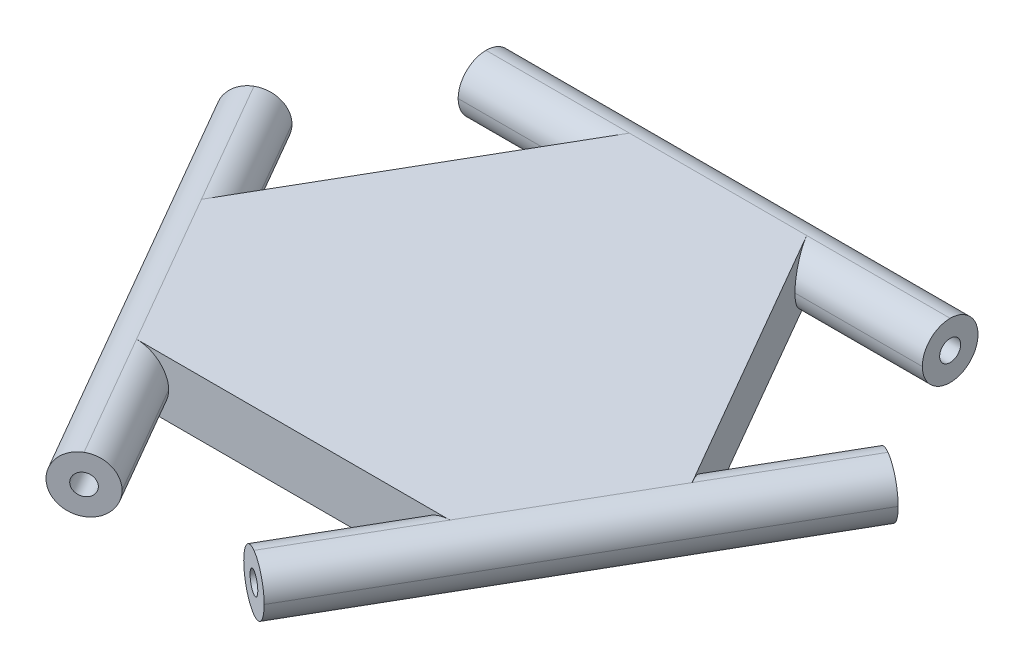
ISO-10303-21;
HEADER;
FILE_DESCRIPTION(('STEP AP214'),'2;1');
FILE_NAME('part.step','',(''),(''),'','','');
FILE_SCHEMA(('AUTOMOTIVE_DESIGN { 1 0 10303 214 1 1 1 1 }'));
ENDSEC;
DATA;
#1=APPLICATION_CONTEXT('core data for automotive mechanical design processes');
#2=APPLICATION_PROTOCOL_DEFINITION('international standard','automotive_design',2000,#1);
#3=PRODUCT_CONTEXT('',#1,'mechanical');
#4=PRODUCT('Part','Part','',(#3));
#5=PRODUCT_RELATED_PRODUCT_CATEGORY('part','',(#4));
#6=PRODUCT_DEFINITION_FORMATION('','',#4);
#7=PRODUCT_DEFINITION_CONTEXT('part definition',#1,'design');
#8=PRODUCT_DEFINITION('design','',#6,#7);
#9=PRODUCT_DEFINITION_SHAPE('','',#8);
#10=(LENGTH_UNIT() NAMED_UNIT(*) SI_UNIT(.MILLI.,.METRE.));
#11=(NAMED_UNIT(*) PLANE_ANGLE_UNIT() SI_UNIT($,.RADIAN.));
#12=(NAMED_UNIT(*) SI_UNIT($,.STERADIAN.) SOLID_ANGLE_UNIT());
#13=UNCERTAINTY_MEASURE_WITH_UNIT(LENGTH_MEASURE(1.E-05),#10,'distance_accuracy_value','');
#14=(GEOMETRIC_REPRESENTATION_CONTEXT(3) GLOBAL_UNCERTAINTY_ASSIGNED_CONTEXT((#13)) GLOBAL_UNIT_ASSIGNED_CONTEXT((#10,
#11,#12)) REPRESENTATION_CONTEXT('',''));
#15=CARTESIAN_POINT('',(0.,0.,0.));
#16=DIRECTION('',(0.,0.,1.));
#17=DIRECTION('',(1.,0.,0.));
#18=AXIS2_PLACEMENT_3D('',#15,#16,#17);
#19=CARTESIAN_POINT('',(25.,6.,-22.));
#20=DIRECTION('',(-1.,0.,0.));
#21=DIRECTION('',(0.,0.,1.));
#22=AXIS2_PLACEMENT_3D('',#19,#20,#21);
#23=PLANE('',#22);
#24=CARTESIAN_POINT('',(25.,3.,-25.));
#25=DIRECTION('',(-1.,0.,0.));
#26=DIRECTION('',(0.,0.,1.));
#27=AXIS2_PLACEMENT_3D('',#24,#25,#26);
#28=CIRCLE('',#27,1.13029999999999);
#29=CARTESIAN_POINT('',(25.,3.,-23.8697));
#30=VERTEX_POINT('',#29);
#31=EDGE_CURVE('E708',#30,#30,#28,.T.);
#32=ORIENTED_EDGE('',*,*,#31,.T.);
#33=EDGE_LOOP('',(#32));
#34=FACE_BOUND('',#33,.T.);
#35=CARTESIAN_POINT('',(25.,3.,-25.));
#36=DIRECTION('',(-1.,0.,0.));
#37=DIRECTION('',(0.,0.,1.));
#38=AXIS2_PLACEMENT_3D('',#35,#36,#37);
#39=CIRCLE('',#38,3.);
#40=CARTESIAN_POINT('',(25.,6.,-25.));
#41=VERTEX_POINT('',#40);
#42=CARTESIAN_POINT('',(25.,3.,-22.));
#43=VERTEX_POINT('',#42);
#44=EDGE_CURVE('E241',#41,#43,#39,.F.);
#45=ORIENTED_EDGE('',*,*,#44,.T.);
#46=CARTESIAN_POINT('',(25.,3.,-25.));
#47=DIRECTION('',(-1.,0.,0.));
#48=DIRECTION('',(0.,0.,1.));
#49=AXIS2_PLACEMENT_3D('',#46,#47,#48);
#50=CIRCLE('',#49,3.);
#51=CARTESIAN_POINT('',(25.,0.,-25.));
#52=VERTEX_POINT('',#51);
#53=EDGE_CURVE('E243',#43,#52,#50,.F.);
#54=ORIENTED_EDGE('',*,*,#53,.T.);
#55=CARTESIAN_POINT('',(25.,3.,-25.));
#56=DIRECTION('',(-1.,0.,0.));
#57=DIRECTION('',(0.,0.,1.));
#58=AXIS2_PLACEMENT_3D('',#55,#56,#57);
#59=CIRCLE('',#58,3.);
#60=CARTESIAN_POINT('',(25.,3.,-28.));
#61=VERTEX_POINT('',#60);
#62=EDGE_CURVE('E239',#52,#61,#59,.F.);
#63=ORIENTED_EDGE('',*,*,#62,.T.);
#64=CARTESIAN_POINT('',(25.,3.,-25.));
#65=DIRECTION('',(-1.,0.,0.));
#66=DIRECTION('',(0.,0.,1.));
#67=AXIS2_PLACEMENT_3D('',#64,#65,#66);
#68=CIRCLE('',#67,3.);
#69=EDGE_CURVE('E237',#61,#41,#68,.F.);
#70=ORIENTED_EDGE('',*,*,#69,.T.);
#71=EDGE_LOOP('',(#45,#54,#63,#70));
#72=FACE_BOUND('',#71,.T.);
#73=ADVANCED_FACE('F35',(#34,#72),#23,.F.);
#74=CARTESIAN_POINT('',(-25.,6.,-22.));
#75=DIRECTION('',(1.,0.,0.));
#76=DIRECTION('',(0.,0.,-1.));
#77=AXIS2_PLACEMENT_3D('',#74,#75,#76);
#78=PLANE('',#77);
#79=CARTESIAN_POINT('',(-25.,3.,-25.));
#80=DIRECTION('',(-1.,0.,0.));
#81=DIRECTION('',(0.,0.,1.));
#82=AXIS2_PLACEMENT_3D('',#79,#80,#81);
#83=CIRCLE('',#82,1.13029999999999);
#84=CARTESIAN_POINT('',(-25.,3.,-23.8697));
#85=VERTEX_POINT('',#84);
#86=EDGE_CURVE('E706',#85,#85,#83,.T.);
#87=ORIENTED_EDGE('',*,*,#86,.F.);
#88=EDGE_LOOP('',(#87));
#89=FACE_BOUND('',#88,.T.);
#90=CARTESIAN_POINT('',(-25.,3.,-25.));
#91=DIRECTION('',(1.,0.,0.));
#92=DIRECTION('',(0.,0.,-1.));
#93=AXIS2_PLACEMENT_3D('',#90,#91,#92);
#94=CIRCLE('',#93,3.);
#95=CARTESIAN_POINT('',(-25.,0.,-25.));
#96=VERTEX_POINT('',#95);
#97=CARTESIAN_POINT('',(-25.,3.,-22.));
#98=VERTEX_POINT('',#97);
#99=EDGE_CURVE('E250',#96,#98,#94,.F.);
#100=ORIENTED_EDGE('',*,*,#99,.T.);
#101=CARTESIAN_POINT('',(-25.,3.,-25.));
#102=DIRECTION('',(1.,0.,0.));
#103=DIRECTION('',(0.,0.,-1.));
#104=AXIS2_PLACEMENT_3D('',#101,#102,#103);
#105=CIRCLE('',#104,3.);
#106=CARTESIAN_POINT('',(-25.,6.,-25.));
#107=VERTEX_POINT('',#106);
#108=EDGE_CURVE('E252',#98,#107,#105,.F.);
#109=ORIENTED_EDGE('',*,*,#108,.T.);
#110=CARTESIAN_POINT('',(-25.,3.,-25.));
#111=DIRECTION('',(1.,0.,0.));
#112=DIRECTION('',(0.,0.,-1.));
#113=AXIS2_PLACEMENT_3D('',#110,#111,#112);
#114=CIRCLE('',#113,3.);
#115=CARTESIAN_POINT('',(-25.,3.,-28.));
#116=VERTEX_POINT('',#115);
#117=EDGE_CURVE('E246',#107,#116,#114,.F.);
#118=ORIENTED_EDGE('',*,*,#117,.T.);
#119=CARTESIAN_POINT('',(-25.,3.,-25.));
#120=DIRECTION('',(1.,0.,0.));
#121=DIRECTION('',(0.,0.,-1.));
#122=AXIS2_PLACEMENT_3D('',#119,#120,#121);
#123=CIRCLE('',#122,3.);
#124=EDGE_CURVE('E248',#116,#96,#123,.F.);
#125=ORIENTED_EDGE('',*,*,#124,.T.);
#126=EDGE_LOOP('',(#100,#109,#118,#125));
#127=FACE_BOUND('',#126,.T.);
#128=ADVANCED_FACE('F400',(#89,#127),#78,.F.);
#129=CARTESIAN_POINT('',(-24.6949695109559,6.,1.22705811566007));
#130=DIRECTION('',(0.866025403784449,0.,0.499999999999982));
#131=DIRECTION('',(0.499999999999982,0.,-0.866025403784449));
#132=AXIS2_PLACEMENT_3D('',#129,#130,#131);
#133=PLANE('',#132);
#134=DIRECTION('',(-0.499999999999982,0.,0.866025403784449));
#135=VECTOR('',#134,1.);
#136=CARTESIAN_POINT('',(-24.6949695109559,0.,1.22705811566007));
#137=LINE('',#136,#135);
#138=CARTESIAN_POINT('',(-9.55277044782832,0.,-25.));
#139=VERTEX_POINT('',#138);
#140=CARTESIAN_POINT('',(-26.4270203185252,0.,4.22705811566036));
#141=VERTEX_POINT('',#140);
#142=EDGE_CURVE('E310',#139,#141,#137,.T.);
#143=ORIENTED_EDGE('',*,*,#142,.T.);
#144=CARTESIAN_POINT('',(-26.4270203185247,3.,4.22705811566008));
#145=DIRECTION('',(0.866025403784449,0.,0.499999999999982));
#146=DIRECTION('',(-0.499999999999982,0.,0.866025403784449));
#147=AXIS2_PLACEMENT_3D('',#144,#145,#146);
#148=ELLIPSE('',#147,3.46410161513773,3.);
#149=CARTESIAN_POINT('',(-24.6949695109559,3.,1.22705811566007));
#150=VERTEX_POINT('',#149);
#151=EDGE_CURVE('E58',#141,#150,#148,.T.);
#152=ORIENTED_EDGE('',*,*,#151,.T.);
#153=CARTESIAN_POINT('',(-26.4270203185247,3.,4.22705811566009));
#154=DIRECTION('',(0.866025403784449,0.,0.499999999999982));
#155=DIRECTION('',(0.499999999999982,0.,-0.866025403784449));
#156=AXIS2_PLACEMENT_3D('',#153,#154,#155);
#157=ELLIPSE('',#156,3.46410161513773,3.);
#158=CARTESIAN_POINT('',(-26.4270203185252,6.,4.22705811566036));
#159=VERTEX_POINT('',#158);
#160=EDGE_CURVE('E293',#150,#159,#157,.T.);
#161=ORIENTED_EDGE('',*,*,#160,.T.);
#162=DIRECTION('',(-0.499999999999982,0.,0.866025403784449));
#163=VECTOR('',#162,1.);
#164=CARTESIAN_POINT('',(-24.6949695109559,6.,1.22705811566007));
#165=LINE('',#164,#163);
#166=CARTESIAN_POINT('',(-9.55277044782832,6.,-25.));
#167=VERTEX_POINT('',#166);
#168=EDGE_CURVE('E378',#167,#159,#165,.T.);
#169=ORIENTED_EDGE('',*,*,#168,.F.);
#170=CARTESIAN_POINT('',(-9.55277044782832,3.,-25.));
#171=DIRECTION('',(0.866025403784449,0.,0.499999999999982));
#172=DIRECTION('',(0.499999999999982,0.,-0.866025403784449));
#173=AXIS2_PLACEMENT_3D('',#170,#171,#172);
#174=ELLIPSE('',#173,3.46410161513771,3.);
#175=CARTESIAN_POINT('',(-11.2848212553971,3.,-22.));
#176=VERTEX_POINT('',#175);
#177=EDGE_CURVE('E288',#167,#176,#174,.T.);
#178=ORIENTED_EDGE('',*,*,#177,.T.);
#179=CARTESIAN_POINT('',(-9.55277044782832,3.,-25.));
#180=DIRECTION('',(0.866025403784449,0.,0.499999999999982));
#181=DIRECTION('',(-0.499999999999982,0.,0.866025403784449));
#182=AXIS2_PLACEMENT_3D('',#179,#180,#181);
#183=ELLIPSE('',#182,3.46410161513771,3.);
#184=EDGE_CURVE('E290',#176,#139,#183,.T.);
#185=ORIENTED_EDGE('',*,*,#184,.T.);
#186=EDGE_LOOP('',(#143,#152,#161,#169,#178,#185));
#187=FACE_BOUND('',#186,.T.);
#188=ADVANCED_FACE('F377',(#187),#133,.F.);
#189=CARTESIAN_POINT('',(-31.5525588832582,6.,-10.650635094611));
#190=DIRECTION('',(0.500000000000001,0.,0.866025403784438));
#191=DIRECTION('',(0.866025403784438,0.,-0.500000000000001));
#192=AXIS2_PLACEMENT_3D('',#189,#190,#191);
#193=PLANE('',#192);
#194=CARTESIAN_POINT('',(-34.1506350946116,3.,-9.15063509461093));
#195=DIRECTION('',(0.500000000000001,0.,0.866025403784438));
#196=DIRECTION('',(0.866025403784438,0.,-0.500000000000001));
#197=AXIS2_PLACEMENT_3D('',#194,#195,#196);
#198=CIRCLE('',#197,1.13029999999999);
#199=CARTESIAN_POINT('',(-33.171766580714,3.,-9.71578509461093));
#200=VERTEX_POINT('',#199);
#201=EDGE_CURVE('E333',#200,#200,#198,.T.);
#202=ORIENTED_EDGE('',*,*,#201,.T.);
#203=EDGE_LOOP('',(#202));
#204=FACE_BOUND('',#203,.T.);
#205=CARTESIAN_POINT('',(-34.1506350946115,3.,-9.15063509461096));
#206=DIRECTION('',(0.500000000000001,0.,0.866025403784438));
#207=DIRECTION('',(0.866025403784438,0.,-0.500000000000001));
#208=AXIS2_PLACEMENT_3D('',#205,#206,#207);
#209=CIRCLE('',#208,3.);
#210=CARTESIAN_POINT('',(-36.7487113059648,3.,-7.65063509461096));
#211=VERTEX_POINT('',#210);
#212=CARTESIAN_POINT('',(-34.1506350946115,6.,-9.15063509461096));
#213=VERTEX_POINT('',#212);
#214=EDGE_CURVE('E255',#211,#213,#209,.F.);
#215=ORIENTED_EDGE('',*,*,#214,.T.);
#216=CARTESIAN_POINT('',(-34.1506350946115,3.,-9.15063509461096));
#217=DIRECTION('',(0.500000000000001,0.,0.866025403784438));
#218=DIRECTION('',(0.866025403784438,0.,-0.500000000000001));
#219=AXIS2_PLACEMENT_3D('',#216,#217,#218);
#220=CIRCLE('',#219,3.);
#221=CARTESIAN_POINT('',(-31.5525588832582,3.,-10.650635094611));
#222=VERTEX_POINT('',#221);
#223=EDGE_CURVE('E261',#213,#222,#220,.F.);
#224=ORIENTED_EDGE('',*,*,#223,.T.);
#225=CARTESIAN_POINT('',(-34.1506350946115,3.,-9.15063509461096));
#226=DIRECTION('',(0.500000000000001,0.,0.866025403784438));
#227=DIRECTION('',(0.866025403784438,0.,-0.500000000000001));
#228=AXIS2_PLACEMENT_3D('',#225,#226,#227);
#229=CIRCLE('',#228,3.);
#230=CARTESIAN_POINT('',(-34.1506350946115,0.,-9.15063509461096));
#231=VERTEX_POINT('',#230);
#232=EDGE_CURVE('E259',#222,#231,#229,.F.);
#233=ORIENTED_EDGE('',*,*,#232,.T.);
#234=CARTESIAN_POINT('',(-34.1506350946115,3.,-9.15063509461095));
#235=DIRECTION('',(0.500000000000001,0.,0.866025403784438));
#236=DIRECTION('',(0.866025403784438,0.,-0.500000000000001));
#237=AXIS2_PLACEMENT_3D('',#234,#235,#236);
#238=CIRCLE('',#237,3.);
#239=EDGE_CURVE('E257',#231,#211,#238,.F.);
#240=ORIENTED_EDGE('',*,*,#239,.T.);
#241=EDGE_LOOP('',(#215,#224,#233,#240));
#242=FACE_BOUND('',#241,.T.);
#243=ADVANCED_FACE('F369',(#204,#242),#193,.F.);
#244=CARTESIAN_POINT('',(-6.55255888325819,6.,32.650635094611));
#245=DIRECTION('',(-0.500000000000001,0.,-0.866025403784438));
#246=DIRECTION('',(-0.866025403784438,0.,0.500000000000001));
#247=AXIS2_PLACEMENT_3D('',#244,#245,#246);
#248=PLANE('',#247);
#249=CARTESIAN_POINT('',(-9.15063509461152,3.,34.150635094611));
#250=DIRECTION('',(0.500000000000001,0.,0.866025403784438));
#251=DIRECTION('',(0.866025403784438,0.,-0.500000000000001));
#252=AXIS2_PLACEMENT_3D('',#249,#250,#251);
#253=CIRCLE('',#252,1.13029999999999);
#254=CARTESIAN_POINT('',(-8.17176658071398,3.,33.585485094611));
#255=VERTEX_POINT('',#254);
#256=EDGE_CURVE('E718',#255,#255,#253,.T.);
#257=ORIENTED_EDGE('',*,*,#256,.F.);
#258=EDGE_LOOP('',(#257));
#259=FACE_BOUND('',#258,.T.);
#260=CARTESIAN_POINT('',(-9.15063509461151,3.,34.150635094611));
#261=DIRECTION('',(-0.500000000000001,0.,-0.866025403784438));
#262=DIRECTION('',(-0.866025403784438,0.,0.500000000000001));
#263=AXIS2_PLACEMENT_3D('',#260,#261,#262);
#264=CIRCLE('',#263,3.);
#265=CARTESIAN_POINT('',(-11.7487113059648,3.,35.650635094611));
#266=VERTEX_POINT('',#265);
#267=CARTESIAN_POINT('',(-9.15063509461151,0.,34.150635094611));
#268=VERTEX_POINT('',#267);
#269=EDGE_CURVE('E266',#266,#268,#264,.F.);
#270=ORIENTED_EDGE('',*,*,#269,.T.);
#271=CARTESIAN_POINT('',(-9.15063509461151,3.,34.150635094611));
#272=DIRECTION('',(-0.500000000000001,0.,-0.866025403784438));
#273=DIRECTION('',(-0.866025403784438,0.,0.500000000000001));
#274=AXIS2_PLACEMENT_3D('',#271,#272,#273);
#275=CIRCLE('',#274,3.);
#276=CARTESIAN_POINT('',(-6.55255888325819,3.,32.650635094611));
#277=VERTEX_POINT('',#276);
#278=EDGE_CURVE('E270',#268,#277,#275,.F.);
#279=ORIENTED_EDGE('',*,*,#278,.T.);
#280=CARTESIAN_POINT('',(-9.1506350946115,3.,34.150635094611));
#281=DIRECTION('',(-0.500000000000001,0.,-0.866025403784438));
#282=DIRECTION('',(-0.866025403784438,0.,0.500000000000001));
#283=AXIS2_PLACEMENT_3D('',#280,#281,#282);
#284=CIRCLE('',#283,3.);
#285=CARTESIAN_POINT('',(-9.15063509461151,6.,34.150635094611));
#286=VERTEX_POINT('',#285);
#287=EDGE_CURVE('E268',#277,#286,#284,.F.);
#288=ORIENTED_EDGE('',*,*,#287,.T.);
#289=CARTESIAN_POINT('',(-9.15063509461151,3.,34.150635094611));
#290=DIRECTION('',(-0.500000000000001,0.,-0.866025403784438));
#291=DIRECTION('',(-0.866025403784438,0.,0.500000000000001));
#292=AXIS2_PLACEMENT_3D('',#289,#290,#291);
#293=CIRCLE('',#292,3.);
#294=EDGE_CURVE('E264',#286,#266,#293,.F.);
#295=ORIENTED_EDGE('',*,*,#294,.T.);
#296=EDGE_LOOP('',(#270,#279,#288,#295));
#297=FACE_BOUND('',#296,.T.);
#298=ADVANCED_FACE('F357',(#259,#297),#248,.F.);
#299=CARTESIAN_POINT('',(13.4101482555593,6.,20.7729418843402));
#300=DIRECTION('',(0.,0.,-1.));
#301=DIRECTION('',(-1.,0.,0.));
#302=AXIS2_PLACEMENT_3D('',#299,#300,#301);
#303=PLANE('',#302);
#304=DIRECTION('',(1.,0.,0.));
#305=VECTOR('',#304,1.);
#306=CARTESIAN_POINT('',(13.4101482555593,0.,20.7729418843402));
#307=LINE('',#306,#305);
#308=CARTESIAN_POINT('',(-16.8742498706974,0.,20.7729418843405));
#309=VERTEX_POINT('',#308);
#310=CARTESIAN_POINT('',(16.874249870697,0.,20.7729418843402));
#311=VERTEX_POINT('',#310);
#312=EDGE_CURVE('E407',#309,#311,#307,.T.);
#313=ORIENTED_EDGE('',*,*,#312,.T.);
#314=CARTESIAN_POINT('',(16.874249870697,3.,20.7729418843402));
#315=DIRECTION('',(0.,0.,-1.));
#316=DIRECTION('',(1.,0.,0.));
#317=AXIS2_PLACEMENT_3D('',#314,#315,#316);
#318=ELLIPSE('',#317,3.46410161513775,3.);
#319=CARTESIAN_POINT('',(13.4101482555593,3.,20.7729418843402));
#320=VERTEX_POINT('',#319);
#321=EDGE_CURVE('E187',#311,#320,#318,.T.);
#322=ORIENTED_EDGE('',*,*,#321,.T.);
#323=CARTESIAN_POINT('',(16.874249870697,3.,20.7729418843402));
#324=DIRECTION('',(0.,0.,-1.));
#325=DIRECTION('',(-1.,0.,0.));
#326=AXIS2_PLACEMENT_3D('',#323,#324,#325);
#327=ELLIPSE('',#326,3.46410161513775,3.);
#328=CARTESIAN_POINT('',(16.874249870697,6.,20.7729418843402));
#329=VERTEX_POINT('',#328);
#330=EDGE_CURVE('E274',#320,#329,#327,.T.);
#331=ORIENTED_EDGE('',*,*,#330,.T.);
#332=DIRECTION('',(1.,0.,0.));
#333=VECTOR('',#332,1.);
#334=CARTESIAN_POINT('',(13.4101482555593,6.,20.7729418843402));
#335=LINE('',#334,#333);
#336=CARTESIAN_POINT('',(-16.8742498706974,6.,20.7729418843405));
#337=VERTEX_POINT('',#336);
#338=EDGE_CURVE('E382',#337,#329,#335,.T.);
#339=ORIENTED_EDGE('',*,*,#338,.F.);
#340=CARTESIAN_POINT('',(-16.8742498706969,3.,20.7729418843402));
#341=DIRECTION('',(0.,0.,-1.));
#342=DIRECTION('',(-1.,0.,0.));
#343=AXIS2_PLACEMENT_3D('',#340,#341,#342);
#344=ELLIPSE('',#343,3.46410161513769,3.);
#345=CARTESIAN_POINT('',(-13.4101482555592,3.,20.7729418843402));
#346=VERTEX_POINT('',#345);
#347=EDGE_CURVE('E11',#337,#346,#344,.T.);
#348=ORIENTED_EDGE('',*,*,#347,.T.);
#349=CARTESIAN_POINT('',(-16.8742498706969,3.,20.7729418843402));
#350=DIRECTION('',(0.,0.,-1.));
#351=DIRECTION('',(1.,0.,0.));
#352=AXIS2_PLACEMENT_3D('',#349,#350,#351);
#353=ELLIPSE('',#352,3.46410161513769,3.);
#354=EDGE_CURVE('E44',#346,#309,#353,.T.);
#355=ORIENTED_EDGE('',*,*,#354,.T.);
#356=EDGE_LOOP('',(#313,#322,#331,#339,#348,#355));
#357=FACE_BOUND('',#356,.T.);
#358=ADVANCED_FACE('F411',(#357),#303,.F.);
#359=CARTESIAN_POINT('',(6.55255888325738,6.,32.6506350946115));
#360=DIRECTION('',(0.499999999999999,0.,-0.866025403784439));
#361=DIRECTION('',(-0.866025403784439,0.,-0.499999999999999));
#362=AXIS2_PLACEMENT_3D('',#359,#360,#361);
#363=PLANE('',#362);
#364=CARTESIAN_POINT('',(9.15063509461071,3.,34.1506350946115));
#365=DIRECTION('',(0.499999999999999,0.,-0.866025403784439));
#366=DIRECTION('',(-0.866025403784439,0.,-0.499999999999999));
#367=AXIS2_PLACEMENT_3D('',#364,#365,#366);
#368=CIRCLE('',#367,1.13029999999999);
#369=CARTESIAN_POINT('',(8.17176658071317,3.,33.5854850946115));
#370=VERTEX_POINT('',#369);
#371=EDGE_CURVE('E712',#370,#370,#368,.T.);
#372=ORIENTED_EDGE('',*,*,#371,.T.);
#373=EDGE_LOOP('',(#372));
#374=FACE_BOUND('',#373,.T.);
#375=CARTESIAN_POINT('',(9.15063509461069,3.,34.1506350946115));
#376=DIRECTION('',(0.499999999999999,0.,-0.866025403784439));
#377=DIRECTION('',(-0.866025403784439,0.,-0.499999999999999));
#378=AXIS2_PLACEMENT_3D('',#375,#376,#377);
#379=CIRCLE('',#378,3.);
#380=CARTESIAN_POINT('',(9.1506350946107,6.,34.1506350946115));
#381=VERTEX_POINT('',#380);
#382=CARTESIAN_POINT('',(6.55255888325738,3.,32.6506350946115));
#383=VERTEX_POINT('',#382);
#384=EDGE_CURVE('E201',#381,#383,#379,.F.);
#385=ORIENTED_EDGE('',*,*,#384,.T.);
#386=CARTESIAN_POINT('',(9.15063509461069,3.,34.1506350946115));
#387=DIRECTION('',(0.499999999999999,0.,-0.866025403784439));
#388=DIRECTION('',(-0.866025403784439,0.,-0.499999999999999));
#389=AXIS2_PLACEMENT_3D('',#386,#387,#388);
#390=CIRCLE('',#389,3.);
#391=CARTESIAN_POINT('',(9.15063509461069,0.,34.1506350946115));
#392=VERTEX_POINT('',#391);
#393=EDGE_CURVE('E185',#383,#392,#390,.F.);
#394=ORIENTED_EDGE('',*,*,#393,.T.);
#395=CARTESIAN_POINT('',(9.15063509461069,3.,34.1506350946115));
#396=DIRECTION('',(0.499999999999999,0.,-0.866025403784439));
#397=DIRECTION('',(-0.866025403784439,0.,-0.499999999999999));
#398=AXIS2_PLACEMENT_3D('',#395,#396,#397);
#399=CIRCLE('',#398,3.);
#400=CARTESIAN_POINT('',(11.748711305964,3.,35.6506350946115));
#401=VERTEX_POINT('',#400);
#402=EDGE_CURVE('E194',#392,#401,#399,.F.);
#403=ORIENTED_EDGE('',*,*,#402,.T.);
#404=CARTESIAN_POINT('',(9.15063509461069,3.,34.1506350946115));
#405=DIRECTION('',(0.499999999999999,0.,-0.866025403784439));
#406=DIRECTION('',(-0.866025403784439,0.,-0.499999999999999));
#407=AXIS2_PLACEMENT_3D('',#404,#405,#406);
#408=CIRCLE('',#407,3.);
#409=EDGE_CURVE('E202',#401,#381,#408,.F.);
#410=ORIENTED_EDGE('',*,*,#409,.T.);
#411=EDGE_LOOP('',(#385,#394,#403,#410));
#412=FACE_BOUND('',#411,.T.);
#413=ADVANCED_FACE('F204',(#374,#412),#363,.F.);
#414=CARTESIAN_POINT('',(31.5525588832574,6.,-10.6506350946105));
#415=DIRECTION('',(-0.5,0.,0.866025403784439));
#416=DIRECTION('',(0.866025403784439,0.,0.5));
#417=AXIS2_PLACEMENT_3D('',#414,#415,#416);
#418=PLANE('',#417);
#419=CARTESIAN_POINT('',(34.1506350946107,3.,-9.15063509461049));
#420=DIRECTION('',(0.5,0.,-0.866025403784439));
#421=DIRECTION('',(-0.866025403784439,0.,-0.5));
#422=AXIS2_PLACEMENT_3D('',#419,#420,#421);
#423=CIRCLE('',#422,1.13029999999999);
#424=CARTESIAN_POINT('',(33.1717665807131,3.,-9.71578509461048));
#425=VERTEX_POINT('',#424);
#426=EDGE_CURVE('E709',#425,#425,#423,.T.);
#427=ORIENTED_EDGE('',*,*,#426,.F.);
#428=EDGE_LOOP('',(#427));
#429=FACE_BOUND('',#428,.T.);
#430=CARTESIAN_POINT('',(34.1506350946107,3.,-9.15063509461049));
#431=DIRECTION('',(-0.5,0.,0.866025403784439));
#432=DIRECTION('',(0.866025403784439,0.,0.5));
#433=AXIS2_PLACEMENT_3D('',#430,#431,#432);
#434=CIRCLE('',#433,3.);
#435=CARTESIAN_POINT('',(36.748711305964,3.,-7.65063509461049));
#436=VERTEX_POINT('',#435);
#437=CARTESIAN_POINT('',(34.1506350946107,0.,-9.15063509461049));
#438=VERTEX_POINT('',#437);
#439=EDGE_CURVE('E230',#436,#438,#434,.F.);
#440=ORIENTED_EDGE('',*,*,#439,.T.);
#441=CARTESIAN_POINT('',(34.1506350946107,3.,-9.15063509461049));
#442=DIRECTION('',(-0.5,0.,0.866025403784439));
#443=DIRECTION('',(0.866025403784439,0.,0.5));
#444=AXIS2_PLACEMENT_3D('',#441,#442,#443);
#445=CIRCLE('',#444,3.);
#446=CARTESIAN_POINT('',(31.5525588832574,3.,-10.6506350946105));
#447=VERTEX_POINT('',#446);
#448=EDGE_CURVE('E234',#438,#447,#445,.F.);
#449=ORIENTED_EDGE('',*,*,#448,.T.);
#450=CARTESIAN_POINT('',(34.1506350946107,3.,-9.15063509461049));
#451=DIRECTION('',(-0.5,0.,0.866025403784439));
#452=DIRECTION('',(0.866025403784439,0.,0.5));
#453=AXIS2_PLACEMENT_3D('',#450,#451,#452);
#454=CIRCLE('',#453,3.);
#455=CARTESIAN_POINT('',(34.1506350946107,6.,-9.15063509461049));
#456=VERTEX_POINT('',#455);
#457=EDGE_CURVE('E232',#447,#456,#454,.F.);
#458=ORIENTED_EDGE('',*,*,#457,.T.);
#459=CARTESIAN_POINT('',(34.1506350946107,3.,-9.15063509461049));
#460=DIRECTION('',(-0.5,0.,0.866025403784439));
#461=DIRECTION('',(0.866025403784439,0.,0.5));
#462=AXIS2_PLACEMENT_3D('',#459,#460,#461);
#463=CIRCLE('',#462,3.);
#464=EDGE_CURVE('E228',#456,#436,#463,.F.);
#465=ORIENTED_EDGE('',*,*,#464,.T.);
#466=EDGE_LOOP('',(#440,#449,#458,#465));
#467=FACE_BOUND('',#466,.T.);
#468=ADVANCED_FACE('F418',(#429,#467),#418,.F.);
#469=CARTESIAN_POINT('',(11.2848212553965,6.,-22.));
#470=DIRECTION('',(-0.866025403784428,0.,0.500000000000018));
#471=DIRECTION('',(0.500000000000018,0.,0.866025403784428));
#472=AXIS2_PLACEMENT_3D('',#469,#470,#471);
#473=PLANE('',#472);
#474=DIRECTION('',(-0.500000000000018,0.,-0.866025403784428));
#475=VECTOR('',#474,1.);
#476=CARTESIAN_POINT('',(11.2848212553965,0.,-22.));
#477=LINE('',#476,#475);
#478=CARTESIAN_POINT('',(26.4270203185251,0.,4.22705811565943));
#479=VERTEX_POINT('',#478);
#480=CARTESIAN_POINT('',(9.5527704478275,0.,-25.));
#481=VERTEX_POINT('',#480);
#482=EDGE_CURVE('E383',#479,#481,#477,.T.);
#483=ORIENTED_EDGE('',*,*,#482,.T.);
#484=CARTESIAN_POINT('',(9.5527704478275,3.,-25.));
#485=DIRECTION('',(-0.866025403784428,0.,0.500000000000018));
#486=DIRECTION('',(-0.500000000000018,0.,-0.866025403784428));
#487=AXIS2_PLACEMENT_3D('',#484,#485,#486);
#488=ELLIPSE('',#487,3.4641016151378,3.);
#489=CARTESIAN_POINT('',(11.2848212553965,3.,-22.));
#490=VERTEX_POINT('',#489);
#491=EDGE_CURVE('E282',#481,#490,#488,.T.);
#492=ORIENTED_EDGE('',*,*,#491,.T.);
#493=CARTESIAN_POINT('',(9.5527704478275,3.,-25.));
#494=DIRECTION('',(-0.866025403784428,0.,0.500000000000018));
#495=DIRECTION('',(0.500000000000018,0.,0.866025403784428));
#496=AXIS2_PLACEMENT_3D('',#493,#494,#495);
#497=ELLIPSE('',#496,3.4641016151378,3.);
#498=CARTESIAN_POINT('',(9.5527704478275,6.,-25.));
#499=VERTEX_POINT('',#498);
#500=EDGE_CURVE('E285',#490,#499,#497,.T.);
#501=ORIENTED_EDGE('',*,*,#500,.T.);
#502=DIRECTION('',(-0.500000000000018,0.,-0.866025403784428));
#503=VECTOR('',#502,1.);
#504=CARTESIAN_POINT('',(11.2848212553965,6.,-22.));
#505=LINE('',#504,#503);
#506=CARTESIAN_POINT('',(26.4270203185251,6.,4.22705811565943));
#507=VERTEX_POINT('',#506);
#508=EDGE_CURVE('E387',#507,#499,#505,.T.);
#509=ORIENTED_EDGE('',*,*,#508,.F.);
#510=CARTESIAN_POINT('',(26.4270203185251,3.,4.22705811565942));
#511=DIRECTION('',(-0.866025403784428,0.,0.500000000000018));
#512=DIRECTION('',(0.500000000000018,0.,0.866025403784428));
#513=AXIS2_PLACEMENT_3D('',#510,#511,#512);
#514=ELLIPSE('',#513,3.46410161513771,3.);
#515=CARTESIAN_POINT('',(24.6949695109562,3.,1.22705811565949));
#516=VERTEX_POINT('',#515);
#517=EDGE_CURVE('E280',#507,#516,#514,.T.);
#518=ORIENTED_EDGE('',*,*,#517,.T.);
#519=CARTESIAN_POINT('',(26.4270203185251,3.,4.22705811565943));
#520=DIRECTION('',(-0.866025403784428,0.,0.500000000000018));
#521=DIRECTION('',(-0.500000000000018,0.,-0.866025403784428));
#522=AXIS2_PLACEMENT_3D('',#519,#520,#521);
#523=ELLIPSE('',#522,3.46410161513771,3.);
#524=EDGE_CURVE('E277',#516,#479,#523,.T.);
#525=ORIENTED_EDGE('',*,*,#524,.T.);
#526=EDGE_LOOP('',(#483,#492,#501,#509,#518,#525));
#527=FACE_BOUND('',#526,.T.);
#528=ADVANCED_FACE('F547',(#527),#473,.F.);
#529=CARTESIAN_POINT('',(0.,6.,0.));
#530=DIRECTION('',(0.,-1.,0.));
#531=DIRECTION('',(0.,0.,-1.));
#532=AXIS2_PLACEMENT_3D('',#529,#530,#531);
#533=PLANE('',#532);
#534=ORIENTED_EDGE('',*,*,#338,.T.);
#535=DIRECTION('',(0.5,0.,-0.866025403784439));
#536=VECTOR('',#535,1.);
#537=CARTESIAN_POINT('',(21.650635094611,6.,12.5));
#538=LINE('',#537,#536);
#539=EDGE_CURVE('E225',#329,#507,#538,.T.);
#540=ORIENTED_EDGE('',*,*,#539,.T.);
#541=ORIENTED_EDGE('',*,*,#508,.T.);
#542=DIRECTION('',(-1.,0.,0.));
#543=VECTOR('',#542,1.);
#544=CARTESIAN_POINT('',(0.,6.,-25.));
#545=LINE('',#544,#543);
#546=EDGE_CURVE('E222',#499,#167,#545,.T.);
#547=ORIENTED_EDGE('',*,*,#546,.T.);
#548=ORIENTED_EDGE('',*,*,#168,.T.);
#549=DIRECTION('',(0.5,0.,0.866025403784438));
#550=VECTOR('',#549,1.);
#551=CARTESIAN_POINT('',(-21.6506350946114,6.,12.5000000000003));
#552=LINE('',#551,#550);
#553=EDGE_CURVE('E219',#159,#337,#552,.T.);
#554=ORIENTED_EDGE('',*,*,#553,.T.);
#555=EDGE_LOOP('',(#534,#540,#541,#547,#548,#554));
#556=FACE_BOUND('',#555,.T.);
#557=ADVANCED_FACE('F386',(#556),#533,.F.);
#558=CARTESIAN_POINT('',(0.,0.,0.));
#559=DIRECTION('',(0.,-1.,0.));
#560=DIRECTION('',(0.,0.,-1.));
#561=AXIS2_PLACEMENT_3D('',#558,#559,#560);
#562=PLANE('',#561);
#563=DIRECTION('',(0.5,0.,-0.866025403784439));
#564=VECTOR('',#563,1.);
#565=CARTESIAN_POINT('',(9.15063509461069,0.,34.1506350946115));
#566=LINE('',#565,#564);
#567=EDGE_CURVE('E216',#479,#311,#566,.F.);
#568=ORIENTED_EDGE('',*,*,#567,.T.);
#569=ORIENTED_EDGE('',*,*,#312,.F.);
#570=DIRECTION('',(0.5,0.,0.866025403784438));
#571=VECTOR('',#570,1.);
#572=CARTESIAN_POINT('',(-34.1506350946115,0.,-9.15063509461097));
#573=LINE('',#572,#571);
#574=EDGE_CURVE('E207',#309,#141,#573,.F.);
#575=ORIENTED_EDGE('',*,*,#574,.T.);
#576=ORIENTED_EDGE('',*,*,#142,.F.);
#577=DIRECTION('',(-1.,0.,0.));
#578=VECTOR('',#577,1.);
#579=CARTESIAN_POINT('',(25.,0.,-25.));
#580=LINE('',#579,#578);
#581=EDGE_CURVE('E210',#139,#481,#580,.F.);
#582=ORIENTED_EDGE('',*,*,#581,.T.);
#583=ORIENTED_EDGE('',*,*,#482,.F.);
#584=EDGE_LOOP('',(#568,#569,#575,#576,#582,#583));
#585=FACE_BOUND('',#584,.T.);
#586=ADVANCED_FACE('F409',(#585),#562,.T.);
#587=CARTESIAN_POINT('',(21.650635094611,3.,12.5));
#588=DIRECTION('',(-0.5,0.,0.866025403784439));
#589=DIRECTION('',(0.866025403784439,0.,0.5));
#590=AXIS2_PLACEMENT_3D('',#587,#588,#589);
#591=CYLINDRICAL_SURFACE('',#590,3.);
#592=DIRECTION('',(-0.5,0.,0.866025403784439));
#593=VECTOR('',#592,1.);
#594=CARTESIAN_POINT('',(21.650635094611,6.,12.5));
#595=LINE('',#594,#593);
#596=EDGE_CURVE('E305',#456,#507,#595,.T.);
#597=ORIENTED_EDGE('',*,*,#596,.F.);
#598=ORIENTED_EDGE('',*,*,#457,.F.);
#599=DIRECTION('',(-0.5,0.,0.866025403784439));
#600=VECTOR('',#599,1.);
#601=CARTESIAN_POINT('',(31.5525588832574,3.,-10.6506350946105));
#602=LINE('',#601,#600);
#603=EDGE_CURVE('E308',#516,#447,#602,.F.);
#604=ORIENTED_EDGE('',*,*,#603,.F.);
#605=ORIENTED_EDGE('',*,*,#517,.F.);
#606=EDGE_LOOP('',(#597,#598,#604,#605));
#607=FACE_BOUND('',#606,.T.);
#608=ADVANCED_FACE('F450',(#607),#591,.T.);
#609=CARTESIAN_POINT('',(34.1506350946107,3.,-9.15063509461049));
#610=DIRECTION('',(0.5,0.,-0.866025403784439));
#611=DIRECTION('',(-0.866025403784439,0.,-0.5));
#612=AXIS2_PLACEMENT_3D('',#609,#610,#611);
#613=CYLINDRICAL_SURFACE('',#612,3.);
#614=ORIENTED_EDGE('',*,*,#603,.T.);
#615=ORIENTED_EDGE('',*,*,#448,.F.);
#616=DIRECTION('',(-0.5,0.,0.866025403784439));
#617=VECTOR('',#616,1.);
#618=CARTESIAN_POINT('',(34.1506350946107,0.,-9.15063509461049));
#619=LINE('',#618,#617);
#620=EDGE_CURVE('E301',#479,#438,#619,.F.);
#621=ORIENTED_EDGE('',*,*,#620,.F.);
#622=ORIENTED_EDGE('',*,*,#524,.F.);
#623=EDGE_LOOP('',(#614,#615,#621,#622));
#624=FACE_BOUND('',#623,.T.);
#625=ADVANCED_FACE('F446',(#624),#613,.T.);
#626=CARTESIAN_POINT('',(21.650635094611,3.,12.5));
#627=DIRECTION('',(0.5,0.,-0.866025403784439));
#628=DIRECTION('',(-0.866025403784439,0.,-0.5));
#629=AXIS2_PLACEMENT_3D('',#626,#627,#628);
#630=CYLINDRICAL_SURFACE('',#629,3.);
#631=DIRECTION('',(0.5,0.,-0.866025403784439));
#632=VECTOR('',#631,1.);
#633=CARTESIAN_POINT('',(21.650635094611,6.,12.5));
#634=LINE('',#633,#632);
#635=EDGE_CURVE('E190',#381,#329,#634,.T.);
#636=ORIENTED_EDGE('',*,*,#635,.F.);
#637=ORIENTED_EDGE('',*,*,#409,.F.);
#638=DIRECTION('',(0.5,0.,-0.866025403784439));
#639=VECTOR('',#638,1.);
#640=CARTESIAN_POINT('',(36.748711305964,3.,-7.65063509461049));
#641=LINE('',#640,#639);
#642=EDGE_CURVE('E198',#436,#401,#641,.F.);
#643=ORIENTED_EDGE('',*,*,#642,.F.);
#644=ORIENTED_EDGE('',*,*,#464,.F.);
#645=ORIENTED_EDGE('',*,*,#596,.T.);
#646=ORIENTED_EDGE('',*,*,#539,.F.);
#647=EDGE_LOOP('',(#636,#637,#643,#644,#645,#646));
#648=FACE_BOUND('',#647,.T.);
#649=ADVANCED_FACE('F443',(#648),#630,.T.);
#650=CARTESIAN_POINT('',(34.1506350946107,3.,-9.15063509461049));
#651=DIRECTION('',(-0.5,0.,0.866025403784439));
#652=DIRECTION('',(0.866025403784439,0.,0.5));
#653=AXIS2_PLACEMENT_3D('',#650,#651,#652);
#654=CYLINDRICAL_SURFACE('',#653,3.);
#655=ORIENTED_EDGE('',*,*,#642,.T.);
#656=ORIENTED_EDGE('',*,*,#402,.F.);
#657=DIRECTION('',(0.5,0.,-0.866025403784439));
#658=VECTOR('',#657,1.);
#659=CARTESIAN_POINT('',(9.15063509461069,0.,34.1506350946115));
#660=LINE('',#659,#658);
#661=EDGE_CURVE('E181',#311,#392,#660,.F.);
#662=ORIENTED_EDGE('',*,*,#661,.F.);
#663=ORIENTED_EDGE('',*,*,#567,.F.);
#664=ORIENTED_EDGE('',*,*,#620,.T.);
#665=ORIENTED_EDGE('',*,*,#439,.F.);
#666=EDGE_LOOP('',(#655,#656,#662,#663,#664,#665));
#667=FACE_BOUND('',#666,.T.);
#668=ADVANCED_FACE('F195',(#667),#654,.T.);
#669=CARTESIAN_POINT('',(21.650635094611,3.,12.5));
#670=DIRECTION('',(-0.5,0.,0.866025403784439));
#671=DIRECTION('',(0.866025403784439,0.,0.5));
#672=AXIS2_PLACEMENT_3D('',#669,#670,#671);
#673=CYLINDRICAL_SURFACE('',#672,3.);
#674=ORIENTED_EDGE('',*,*,#635,.T.);
#675=ORIENTED_EDGE('',*,*,#330,.F.);
#676=DIRECTION('',(-0.5,0.,0.866025403784439));
#677=VECTOR('',#676,1.);
#678=CARTESIAN_POINT('',(13.4101482555593,3.,20.7729418843402));
#679=LINE('',#678,#677);
#680=EDGE_CURVE('E191',#383,#320,#679,.F.);
#681=ORIENTED_EDGE('',*,*,#680,.F.);
#682=ORIENTED_EDGE('',*,*,#384,.F.);
#683=EDGE_LOOP('',(#674,#675,#681,#682));
#684=FACE_BOUND('',#683,.T.);
#685=ADVANCED_FACE('F437',(#684),#673,.T.);
#686=CARTESIAN_POINT('',(16.0082244669126,3.,22.2729418843402));
#687=DIRECTION('',(0.5,0.,-0.866025403784439));
#688=DIRECTION('',(-0.866025403784439,0.,-0.5));
#689=AXIS2_PLACEMENT_3D('',#686,#687,#688);
#690=CYLINDRICAL_SURFACE('',#689,3.);
#691=ORIENTED_EDGE('',*,*,#321,.F.);
#692=ORIENTED_EDGE('',*,*,#661,.T.);
#693=ORIENTED_EDGE('',*,*,#393,.F.);
#694=ORIENTED_EDGE('',*,*,#680,.T.);
#695=EDGE_LOOP('',(#691,#692,#693,#694));
#696=FACE_BOUND('',#695,.T.);
#697=ADVANCED_FACE('F183',(#696),#690,.T.);
#698=CARTESIAN_POINT('',(0.,3.,-25.));
#699=DIRECTION('',(1.,0.,0.));
#700=DIRECTION('',(0.,0.,-1.));
#701=AXIS2_PLACEMENT_3D('',#698,#699,#700);
#702=CYLINDRICAL_SURFACE('',#701,3.);
#703=DIRECTION('',(1.,0.,0.));
#704=VECTOR('',#703,1.);
#705=CARTESIAN_POINT('',(0.,6.,-25.));
#706=LINE('',#705,#704);
#707=EDGE_CURVE('E324',#107,#167,#706,.T.);
#708=ORIENTED_EDGE('',*,*,#707,.F.);
#709=ORIENTED_EDGE('',*,*,#108,.F.);
#710=DIRECTION('',(1.,0.,0.));
#711=VECTOR('',#710,1.);
#712=CARTESIAN_POINT('',(-25.,3.,-22.));
#713=LINE('',#712,#711);
#714=EDGE_CURVE('E297',#176,#98,#713,.F.);
#715=ORIENTED_EDGE('',*,*,#714,.F.);
#716=ORIENTED_EDGE('',*,*,#177,.F.);
#717=EDGE_LOOP('',(#708,#709,#715,#716));
#718=FACE_BOUND('',#717,.T.);
#719=ADVANCED_FACE('F392',(#718),#702,.T.);
#720=CARTESIAN_POINT('',(-25.,3.,-25.));
#721=DIRECTION('',(-1.,0.,0.));
#722=DIRECTION('',(0.,0.,1.));
#723=AXIS2_PLACEMENT_3D('',#720,#721,#722);
#724=CYLINDRICAL_SURFACE('',#723,3.);
#725=ORIENTED_EDGE('',*,*,#714,.T.);
#726=ORIENTED_EDGE('',*,*,#99,.F.);
#727=DIRECTION('',(1.,0.,0.));
#728=VECTOR('',#727,1.);
#729=CARTESIAN_POINT('',(-25.,0.,-25.));
#730=LINE('',#729,#728);
#731=EDGE_CURVE('E318',#139,#96,#730,.F.);
#732=ORIENTED_EDGE('',*,*,#731,.F.);
#733=ORIENTED_EDGE('',*,*,#184,.F.);
#734=EDGE_LOOP('',(#725,#726,#732,#733));
#735=FACE_BOUND('',#734,.T.);
#736=ADVANCED_FACE('F403',(#735),#724,.T.);
#737=CARTESIAN_POINT('',(0.,3.,-25.));
#738=DIRECTION('',(-1.,0.,0.));
#739=DIRECTION('',(0.,0.,1.));
#740=AXIS2_PLACEMENT_3D('',#737,#738,#739);
#741=CYLINDRICAL_SURFACE('',#740,3.);
#742=DIRECTION('',(-1.,0.,0.));
#743=VECTOR('',#742,1.);
#744=CARTESIAN_POINT('',(0.,6.,-25.));
#745=LINE('',#744,#743);
#746=EDGE_CURVE('E315',#41,#499,#745,.T.);
#747=ORIENTED_EDGE('',*,*,#746,.F.);
#748=ORIENTED_EDGE('',*,*,#69,.F.);
#749=DIRECTION('',(-1.,0.,0.));
#750=VECTOR('',#749,1.);
#751=CARTESIAN_POINT('',(-25.,3.,-28.));
#752=LINE('',#751,#750);
#753=EDGE_CURVE('E321',#116,#61,#752,.F.);
#754=ORIENTED_EDGE('',*,*,#753,.F.);
#755=ORIENTED_EDGE('',*,*,#117,.F.);
#756=ORIENTED_EDGE('',*,*,#707,.T.);
#757=ORIENTED_EDGE('',*,*,#546,.F.);
#758=EDGE_LOOP('',(#747,#748,#754,#755,#756,#757));
#759=FACE_BOUND('',#758,.T.);
#760=ADVANCED_FACE('F395',(#759),#741,.T.);
#761=CARTESIAN_POINT('',(-25.,3.,-25.));
#762=DIRECTION('',(1.,0.,0.));
#763=DIRECTION('',(0.,0.,-1.));
#764=AXIS2_PLACEMENT_3D('',#761,#762,#763);
#765=CYLINDRICAL_SURFACE('',#764,3.);
#766=ORIENTED_EDGE('',*,*,#753,.T.);
#767=ORIENTED_EDGE('',*,*,#62,.F.);
#768=DIRECTION('',(-1.,0.,0.));
#769=VECTOR('',#768,1.);
#770=CARTESIAN_POINT('',(25.,0.,-25.));
#771=LINE('',#770,#769);
#772=EDGE_CURVE('E313',#481,#52,#771,.F.);
#773=ORIENTED_EDGE('',*,*,#772,.F.);
#774=ORIENTED_EDGE('',*,*,#581,.F.);
#775=ORIENTED_EDGE('',*,*,#731,.T.);
#776=ORIENTED_EDGE('',*,*,#124,.F.);
#777=EDGE_LOOP('',(#766,#767,#773,#774,#775,#776));
#778=FACE_BOUND('',#777,.T.);
#779=ADVANCED_FACE('F462',(#778),#765,.T.);
#780=CARTESIAN_POINT('',(0.,3.,-25.));
#781=DIRECTION('',(1.,0.,0.));
#782=DIRECTION('',(0.,0.,-1.));
#783=AXIS2_PLACEMENT_3D('',#780,#781,#782);
#784=CYLINDRICAL_SURFACE('',#783,3.);
#785=ORIENTED_EDGE('',*,*,#746,.T.);
#786=ORIENTED_EDGE('',*,*,#500,.F.);
#787=DIRECTION('',(1.,0.,0.));
#788=VECTOR('',#787,1.);
#789=CARTESIAN_POINT('',(11.2848212553965,3.,-22.));
#790=LINE('',#789,#788);
#791=EDGE_CURVE('E311',#43,#490,#790,.F.);
#792=ORIENTED_EDGE('',*,*,#791,.F.);
#793=ORIENTED_EDGE('',*,*,#44,.F.);
#794=EDGE_LOOP('',(#785,#786,#792,#793));
#795=FACE_BOUND('',#794,.T.);
#796=ADVANCED_FACE('F458',(#795),#784,.T.);
#797=CARTESIAN_POINT('',(11.2848212553965,3.,-25.));
#798=DIRECTION('',(-1.,0.,0.));
#799=DIRECTION('',(0.,0.,1.));
#800=AXIS2_PLACEMENT_3D('',#797,#798,#799);
#801=CYLINDRICAL_SURFACE('',#800,3.);
#802=ORIENTED_EDGE('',*,*,#491,.F.);
#803=ORIENTED_EDGE('',*,*,#772,.T.);
#804=ORIENTED_EDGE('',*,*,#53,.F.);
#805=ORIENTED_EDGE('',*,*,#791,.T.);
#806=EDGE_LOOP('',(#802,#803,#804,#805));
#807=FACE_BOUND('',#806,.T.);
#808=ADVANCED_FACE('F455',(#807),#801,.T.);
#809=CARTESIAN_POINT('',(-9.15063509461156,3.,34.1506350946109));
#810=DIRECTION('',(0.49999999999997,0.,0.866025403784456));
#811=DIRECTION('',(0.866025403784456,0.,-0.49999999999997));
#812=AXIS2_PLACEMENT_3D('',#809,#810,#811);
#813=CYLINDRICAL_SURFACE('',#812,3.);
#814=DIRECTION('',(-0.49999999999997,0.,-0.866025403784456));
#815=VECTOR('',#814,1.);
#816=CARTESIAN_POINT('',(-9.15063509461156,0.,34.1506350946109));
#817=LINE('',#816,#815);
#818=EDGE_CURVE('E343',#309,#268,#817,.F.);
#819=ORIENTED_EDGE('',*,*,#818,.F.);
#820=ORIENTED_EDGE('',*,*,#354,.F.);
#821=DIRECTION('',(-0.49999999999997,0.,-0.866025403784456));
#822=VECTOR('',#821,1.);
#823=CARTESIAN_POINT('',(-13.4101482555592,3.,20.7729418843402));
#824=LINE('',#823,#822);
#825=EDGE_CURVE('E39',#277,#346,#824,.T.);
#826=ORIENTED_EDGE('',*,*,#825,.F.);
#827=ORIENTED_EDGE('',*,*,#278,.F.);
#828=EDGE_LOOP('',(#819,#820,#826,#827));
#829=FACE_BOUND('',#828,.T.);
#830=ADVANCED_FACE('F37',(#829),#813,.T.);
#831=CARTESIAN_POINT('',(-21.6506350946111,3.,12.4999999999991));
#832=DIRECTION('',(-0.49999999999997,0.,-0.866025403784456));
#833=DIRECTION('',(-0.866025403784456,0.,0.49999999999997));
#834=AXIS2_PLACEMENT_3D('',#831,#832,#833);
#835=CYLINDRICAL_SURFACE('',#834,3.);
#836=ORIENTED_EDGE('',*,*,#825,.T.);
#837=ORIENTED_EDGE('',*,*,#347,.F.);
#838=DIRECTION('',(-0.49999999999997,0.,-0.866025403784456));
#839=VECTOR('',#838,1.);
#840=CARTESIAN_POINT('',(-21.6506350946111,6.,12.4999999999991));
#841=LINE('',#840,#839);
#842=EDGE_CURVE('E338',#286,#337,#841,.T.);
#843=ORIENTED_EDGE('',*,*,#842,.F.);
#844=ORIENTED_EDGE('',*,*,#287,.F.);
#845=EDGE_LOOP('',(#836,#837,#843,#844));
#846=FACE_BOUND('',#845,.T.);
#847=ADVANCED_FACE('F352',(#846),#835,.T.);
#848=CARTESIAN_POINT('',(-9.15063509461151,3.,34.150635094611));
#849=DIRECTION('',(-0.5,0.,-0.866025403784438));
#850=DIRECTION('',(-0.866025403784438,0.,0.5));
#851=AXIS2_PLACEMENT_3D('',#848,#849,#850);
#852=CYLINDRICAL_SURFACE('',#851,3.);
#853=DIRECTION('',(0.5,0.,0.866025403784438));
#854=VECTOR('',#853,1.);
#855=CARTESIAN_POINT('',(-11.7487113059648,3.,35.650635094611));
#856=LINE('',#855,#854);
#857=EDGE_CURVE('E335',#211,#266,#856,.T.);
#858=ORIENTED_EDGE('',*,*,#857,.F.);
#859=ORIENTED_EDGE('',*,*,#239,.F.);
#860=DIRECTION('',(0.5,0.,0.866025403784438));
#861=VECTOR('',#860,1.);
#862=CARTESIAN_POINT('',(-34.1506350946115,0.,-9.15063509461097));
#863=LINE('',#862,#861);
#864=EDGE_CURVE('E341',#141,#231,#863,.F.);
#865=ORIENTED_EDGE('',*,*,#864,.F.);
#866=ORIENTED_EDGE('',*,*,#574,.F.);
#867=ORIENTED_EDGE('',*,*,#818,.T.);
#868=ORIENTED_EDGE('',*,*,#269,.F.);
#869=EDGE_LOOP('',(#858,#859,#865,#866,#867,#868));
#870=FACE_BOUND('',#869,.T.);
#871=ADVANCED_FACE('F360',(#870),#852,.T.);
#872=CARTESIAN_POINT('',(-27.2930457223092,3.,2.72705811566016));
#873=DIRECTION('',(0.50000000000003,0.,0.866025403784421));
#874=DIRECTION('',(0.866025403784421,0.,-0.50000000000003));
#875=AXIS2_PLACEMENT_3D('',#872,#873,#874);
#876=CYLINDRICAL_SURFACE('',#875,3.);
#877=ORIENTED_EDGE('',*,*,#864,.T.);
#878=ORIENTED_EDGE('',*,*,#232,.F.);
#879=DIRECTION('',(-0.50000000000003,0.,-0.866025403784421));
#880=VECTOR('',#879,1.);
#881=CARTESIAN_POINT('',(-31.5525588832582,3.,-10.650635094611));
#882=LINE('',#881,#880);
#883=EDGE_CURVE('E332',#150,#222,#882,.T.);
#884=ORIENTED_EDGE('',*,*,#883,.F.);
#885=ORIENTED_EDGE('',*,*,#151,.F.);
#886=EDGE_LOOP('',(#877,#878,#884,#885));
#887=FACE_BOUND('',#886,.T.);
#888=ADVANCED_FACE('F373',(#887),#876,.T.);
#889=CARTESIAN_POINT('',(-21.6506350946114,3.,12.5000000000003));
#890=DIRECTION('',(0.5,0.,0.866025403784438));
#891=DIRECTION('',(0.866025403784438,0.,-0.5));
#892=AXIS2_PLACEMENT_3D('',#889,#890,#891);
#893=CYLINDRICAL_SURFACE('',#892,3.);
#894=ORIENTED_EDGE('',*,*,#842,.T.);
#895=ORIENTED_EDGE('',*,*,#553,.F.);
#896=DIRECTION('',(0.5,0.,0.866025403784438));
#897=VECTOR('',#896,1.);
#898=CARTESIAN_POINT('',(-21.6506350946114,6.,12.5000000000003));
#899=LINE('',#898,#897);
#900=EDGE_CURVE('E329',#213,#159,#899,.T.);
#901=ORIENTED_EDGE('',*,*,#900,.F.);
#902=ORIENTED_EDGE('',*,*,#214,.F.);
#903=ORIENTED_EDGE('',*,*,#857,.T.);
#904=ORIENTED_EDGE('',*,*,#294,.F.);
#905=EDGE_LOOP('',(#894,#895,#901,#902,#903,#904));
#906=FACE_BOUND('',#905,.T.);
#907=ADVANCED_FACE('F364',(#906),#893,.T.);
#908=CARTESIAN_POINT('',(-21.6506350946102,3.,12.5000000000006));
#909=DIRECTION('',(-0.50000000000003,0.,-0.866025403784421));
#910=DIRECTION('',(-0.866025403784421,0.,0.50000000000003));
#911=AXIS2_PLACEMENT_3D('',#908,#909,#910);
#912=CYLINDRICAL_SURFACE('',#911,3.);
#913=ORIENTED_EDGE('',*,*,#160,.F.);
#914=ORIENTED_EDGE('',*,*,#883,.T.);
#915=ORIENTED_EDGE('',*,*,#223,.F.);
#916=ORIENTED_EDGE('',*,*,#900,.T.);
#917=EDGE_LOOP('',(#913,#914,#915,#916));
#918=FACE_BOUND('',#917,.T.);
#919=ADVANCED_FACE('F376',(#918),#912,.T.);
#920=CARTESIAN_POINT('',(-9.15063509461152,3.,34.150635094611));
#921=DIRECTION('',(0.500000000000001,0.,0.866025403784438));
#922=DIRECTION('',(0.866025403784438,0.,-0.500000000000001));
#923=AXIS2_PLACEMENT_3D('',#920,#921,#922);
#924=CYLINDRICAL_SURFACE('',#923,1.13029999999999);
#925=ORIENTED_EDGE('',*,*,#256,.T.);
#926=EDGE_LOOP('',(#925));
#927=FACE_BOUND('',#926,.T.);
#928=ORIENTED_EDGE('',*,*,#201,.F.);
#929=EDGE_LOOP('',(#928));
#930=FACE_BOUND('',#929,.T.);
#931=ADVANCED_FACE('F475',(#927,#930),#924,.F.);
#932=CARTESIAN_POINT('',(34.1506350946107,3.,-9.15063509461049));
#933=DIRECTION('',(0.5,0.,-0.866025403784439));
#934=DIRECTION('',(-0.866025403784439,0.,-0.5));
#935=AXIS2_PLACEMENT_3D('',#932,#933,#934);
#936=CYLINDRICAL_SURFACE('',#935,1.13029999999999);
#937=ORIENTED_EDGE('',*,*,#426,.T.);
#938=EDGE_LOOP('',(#937));
#939=FACE_BOUND('',#938,.T.);
#940=ORIENTED_EDGE('',*,*,#371,.F.);
#941=EDGE_LOOP('',(#940));
#942=FACE_BOUND('',#941,.T.);
#943=ADVANCED_FACE('F578',(#939,#942),#936,.F.);
#944=CARTESIAN_POINT('',(-25.,3.,-25.));
#945=DIRECTION('',(-1.,0.,0.));
#946=DIRECTION('',(0.,0.,1.));
#947=AXIS2_PLACEMENT_3D('',#944,#945,#946);
#948=CYLINDRICAL_SURFACE('',#947,1.13029999999999);
#949=ORIENTED_EDGE('',*,*,#86,.T.);
#950=EDGE_LOOP('',(#949));
#951=FACE_BOUND('',#950,.T.);
#952=ORIENTED_EDGE('',*,*,#31,.F.);
#953=EDGE_LOOP('',(#952));
#954=FACE_BOUND('',#953,.T.);
#955=ADVANCED_FACE('F668',(#951,#954),#948,.F.);
#956=CLOSED_SHELL('',(#73,#128,#188,#243,#298,#358,#413,#468,#528,#557,#586,#608,#625,#649,#668,
#685,#697,#719,#736,#760,#779,#796,#808,#830,#847,#871,#888,#907,#919,#931,#943,#955));
#957=MANIFOLD_SOLID_BREP('B2',#956);
#958=ADVANCED_BREP_SHAPE_REPRESENTATION('',(#18,#957),#14);
#959=SHAPE_DEFINITION_REPRESENTATION(#9,#958);
ENDSEC;
END-ISO-10303-21;
